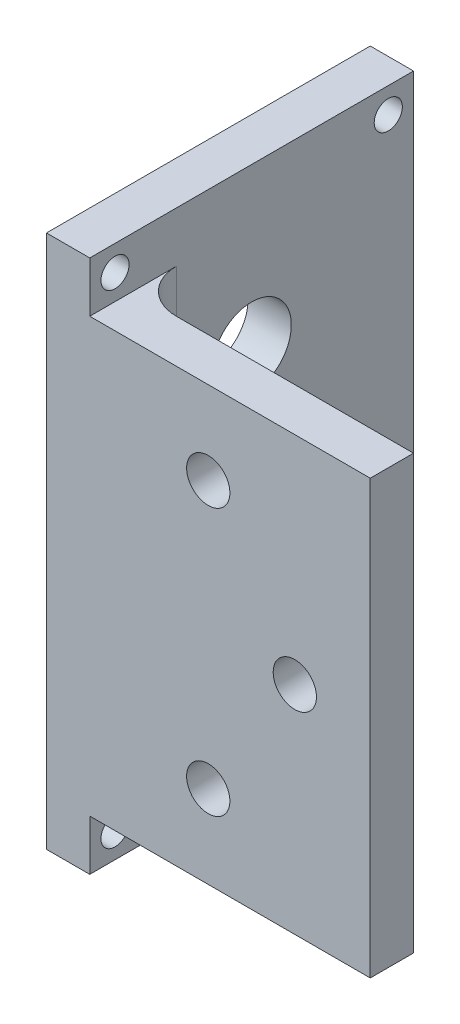
ISO-10303-21;
HEADER;
FILE_DESCRIPTION(('STEP AP214'),'2;1');
FILE_NAME('part.step','',(''),(''),'','','');
FILE_SCHEMA(('AUTOMOTIVE_DESIGN { 1 0 10303 214 1 1 1 1 }'));
ENDSEC;
DATA;
#1=APPLICATION_CONTEXT('core data for automotive mechanical design processes');
#2=APPLICATION_PROTOCOL_DEFINITION('international standard','automotive_design',2000,#1);
#3=PRODUCT_CONTEXT('',#1,'mechanical');
#4=PRODUCT('Part','Part','',(#3));
#5=PRODUCT_RELATED_PRODUCT_CATEGORY('part','',(#4));
#6=PRODUCT_DEFINITION_FORMATION('','',#4);
#7=PRODUCT_DEFINITION_CONTEXT('part definition',#1,'design');
#8=PRODUCT_DEFINITION('design','',#6,#7);
#9=PRODUCT_DEFINITION_SHAPE('','',#8);
#10=(LENGTH_UNIT() NAMED_UNIT(*) SI_UNIT(.MILLI.,.METRE.));
#11=(NAMED_UNIT(*) PLANE_ANGLE_UNIT() SI_UNIT($,.RADIAN.));
#12=(NAMED_UNIT(*) SI_UNIT($,.STERADIAN.) SOLID_ANGLE_UNIT());
#13=UNCERTAINTY_MEASURE_WITH_UNIT(LENGTH_MEASURE(1.E-05),#10,'distance_accuracy_value','');
#14=(GEOMETRIC_REPRESENTATION_CONTEXT(3) GLOBAL_UNCERTAINTY_ASSIGNED_CONTEXT((#13)) GLOBAL_UNIT_ASSIGNED_CONTEXT((#10,
#11,#12)) REPRESENTATION_CONTEXT('',''));
#15=CARTESIAN_POINT('',(0.,0.,0.));
#16=DIRECTION('',(0.,0.,1.));
#17=DIRECTION('',(1.,0.,0.));
#18=AXIS2_PLACEMENT_3D('',#15,#16,#17);
#19=CARTESIAN_POINT('',(22.44,37.,-3.));
#20=DIRECTION('',(0.,0.,1.));
#21=DIRECTION('',(1.,0.,0.));
#22=AXIS2_PLACEMENT_3D('',#19,#20,#21);
#23=PLANE('',#22);
#24=CARTESIAN_POINT('',(11.2127855634639,27.75,-3.));
#25=DIRECTION('',(0.,0.,1.));
#26=DIRECTION('',(1.,0.,0.));
#27=AXIS2_PLACEMENT_3D('',#24,#25,#26);
#28=CIRCLE('',#27,1.5);
#29=CARTESIAN_POINT('',(12.7127855634639,27.75,-3.));
#30=VERTEX_POINT('',#29);
#31=EDGE_CURVE('E188',#30,#30,#28,.T.);
#32=ORIENTED_EDGE('',*,*,#31,.T.);
#33=EDGE_LOOP('',(#32));
#34=FACE_BOUND('',#33,.T.);
#35=CARTESIAN_POINT('',(17.2127855634639,18.5,-3.));
#36=DIRECTION('',(0.,0.,1.));
#37=DIRECTION('',(1.,0.,0.));
#38=AXIS2_PLACEMENT_3D('',#35,#36,#37);
#39=CIRCLE('',#38,1.5);
#40=CARTESIAN_POINT('',(18.7127855634639,18.5,-3.));
#41=VERTEX_POINT('',#40);
#42=EDGE_CURVE('E184',#41,#41,#39,.T.);
#43=ORIENTED_EDGE('',*,*,#42,.T.);
#44=EDGE_LOOP('',(#43));
#45=FACE_BOUND('',#44,.T.);
#46=CARTESIAN_POINT('',(11.2127855634639,9.25,-3.));
#47=DIRECTION('',(0.,0.,1.));
#48=DIRECTION('',(1.,0.,0.));
#49=AXIS2_PLACEMENT_3D('',#46,#47,#48);
#50=CIRCLE('',#49,1.5);
#51=CARTESIAN_POINT('',(12.7127855634639,9.25,-3.));
#52=VERTEX_POINT('',#51);
#53=EDGE_CURVE('E180',#52,#52,#50,.T.);
#54=ORIENTED_EDGE('',*,*,#53,.T.);
#55=EDGE_LOOP('',(#54));
#56=FACE_BOUND('',#55,.T.);
#57=DIRECTION('',(0.,-1.,0.));
#58=VECTOR('',#57,1.);
#59=CARTESIAN_POINT('',(22.44,37.,-3.));
#60=LINE('',#59,#58);
#61=CARTESIAN_POINT('',(22.44,33.5,-3.));
#62=VERTEX_POINT('',#61);
#63=CARTESIAN_POINT('',(22.44,3.5,-3.));
#64=VERTEX_POINT('',#63);
#65=EDGE_CURVE('E206',#62,#64,#60,.T.);
#66=ORIENTED_EDGE('',*,*,#65,.T.);
#67=DIRECTION('',(-1.,0.,0.));
#68=VECTOR('',#67,1.);
#69=CARTESIAN_POINT('',(22.44,3.5,-3.));
#70=LINE('',#69,#68);
#71=CARTESIAN_POINT('',(6.,3.5,-3.));
#72=VERTEX_POINT('',#71);
#73=EDGE_CURVE('E176',#64,#72,#70,.T.);
#74=ORIENTED_EDGE('',*,*,#73,.T.);
#75=DIRECTION('',(0.,-1.,0.));
#76=VECTOR('',#75,1.);
#77=CARTESIAN_POINT('',(6.,37.,-3.));
#78=LINE('',#77,#76);
#79=CARTESIAN_POINT('',(6.,33.5,-3.));
#80=VERTEX_POINT('',#79);
#81=EDGE_CURVE('E235',#72,#80,#78,.F.);
#82=ORIENTED_EDGE('',*,*,#81,.T.);
#83=DIRECTION('',(1.,0.,0.));
#84=VECTOR('',#83,1.);
#85=CARTESIAN_POINT('',(22.44,33.5,-3.));
#86=LINE('',#85,#84);
#87=EDGE_CURVE('E68',#80,#62,#86,.T.);
#88=ORIENTED_EDGE('',*,*,#87,.T.);
#89=EDGE_LOOP('',(#66,#74,#82,#88));
#90=FACE_BOUND('',#89,.T.);
#91=ADVANCED_FACE('F45',(#34,#45,#56,#90),#23,.F.);
#92=CARTESIAN_POINT('',(3.,37.,-3.));
#93=DIRECTION('',(-1.,0.,0.));
#94=DIRECTION('',(0.,0.,1.));
#95=AXIS2_PLACEMENT_3D('',#92,#93,#94);
#96=PLANE('',#95);
#97=CARTESIAN_POINT('',(3.,26.,-11.22));
#98=DIRECTION('',(-1.,0.,0.));
#99=DIRECTION('',(0.,0.,1.));
#100=AXIS2_PLACEMENT_3D('',#97,#98,#99);
#101=CIRCLE('',#100,2.75);
#102=CARTESIAN_POINT('',(3.,26.,-8.47));
#103=VERTEX_POINT('',#102);
#104=EDGE_CURVE('E148',#103,#103,#101,.T.);
#105=ORIENTED_EDGE('',*,*,#104,.T.);
#106=EDGE_LOOP('',(#105));
#107=FACE_BOUND('',#106,.T.);
#108=CARTESIAN_POINT('',(3.,35.25,-20.69));
#109=DIRECTION('',(-1.,0.,0.));
#110=DIRECTION('',(0.,0.,1.));
#111=AXIS2_PLACEMENT_3D('',#108,#109,#110);
#112=CIRCLE('',#111,0.974999999999995);
#113=CARTESIAN_POINT('',(3.,35.25,-19.715));
#114=VERTEX_POINT('',#113);
#115=EDGE_CURVE('E422',#114,#114,#112,.T.);
#116=ORIENTED_EDGE('',*,*,#115,.T.);
#117=EDGE_LOOP('',(#116));
#118=FACE_BOUND('',#117,.T.);
#119=CARTESIAN_POINT('',(3.,1.75,-20.69));
#120=DIRECTION('',(-1.,0.,0.));
#121=DIRECTION('',(0.,0.,1.));
#122=AXIS2_PLACEMENT_3D('',#119,#120,#121);
#123=CIRCLE('',#122,0.974999999999999);
#124=CARTESIAN_POINT('',(3.,1.75,-19.715));
#125=VERTEX_POINT('',#124);
#126=EDGE_CURVE('E425',#125,#125,#123,.T.);
#127=ORIENTED_EDGE('',*,*,#126,.T.);
#128=EDGE_LOOP('',(#127));
#129=FACE_BOUND('',#128,.T.);
#130=CARTESIAN_POINT('',(3.,1.75,-1.75));
#131=DIRECTION('',(-1.,0.,0.));
#132=DIRECTION('',(0.,0.,1.));
#133=AXIS2_PLACEMENT_3D('',#130,#131,#132);
#134=CIRCLE('',#133,0.974999999999999);
#135=CARTESIAN_POINT('',(3.,1.75,-0.775000000000001));
#136=VERTEX_POINT('',#135);
#137=EDGE_CURVE('E430',#136,#136,#134,.T.);
#138=ORIENTED_EDGE('',*,*,#137,.T.);
#139=EDGE_LOOP('',(#138));
#140=FACE_BOUND('',#139,.T.);
#141=CARTESIAN_POINT('',(3.,35.25,-1.75));
#142=DIRECTION('',(-1.,0.,0.));
#143=DIRECTION('',(0.,0.,1.));
#144=AXIS2_PLACEMENT_3D('',#141,#142,#143);
#145=CIRCLE('',#144,0.97500000000001);
#146=CARTESIAN_POINT('',(3.,35.25,-0.77499999999999));
#147=VERTEX_POINT('',#146);
#148=EDGE_CURVE('E436',#147,#147,#145,.T.);
#149=ORIENTED_EDGE('',*,*,#148,.T.);
#150=EDGE_LOOP('',(#149));
#151=FACE_BOUND('',#150,.T.);
#152=DIRECTION('',(0.,-1.,0.));
#153=VECTOR('',#152,1.);
#154=CARTESIAN_POINT('',(3.,0.,-6.));
#155=LINE('',#154,#153);
#156=CARTESIAN_POINT('',(3.,33.5,-6.));
#157=VERTEX_POINT('',#156);
#158=CARTESIAN_POINT('',(3.,3.5,-6.));
#159=VERTEX_POINT('',#158);
#160=EDGE_CURVE('E123',#157,#159,#155,.T.);
#161=ORIENTED_EDGE('',*,*,#160,.T.);
#162=DIRECTION('',(0.,0.,-1.));
#163=VECTOR('',#162,1.);
#164=CARTESIAN_POINT('',(3.,3.5,0.));
#165=LINE('',#164,#163);
#166=CARTESIAN_POINT('',(3.,3.5,0.));
#167=VERTEX_POINT('',#166);
#168=EDGE_CURVE('E61',#167,#159,#165,.T.);
#169=ORIENTED_EDGE('',*,*,#168,.F.);
#170=DIRECTION('',(0.,1.,0.));
#171=VECTOR('',#170,1.);
#172=CARTESIAN_POINT('',(3.,0.,0.));
#173=LINE('',#172,#171);
#174=CARTESIAN_POINT('',(3.,0.,0.));
#175=VERTEX_POINT('',#174);
#176=EDGE_CURVE('E119',#175,#167,#173,.T.);
#177=ORIENTED_EDGE('',*,*,#176,.F.);
#178=DIRECTION('',(0.,0.,-1.));
#179=VECTOR('',#178,1.);
#180=CARTESIAN_POINT('',(3.,0.,-3.));
#181=LINE('',#180,#179);
#182=CARTESIAN_POINT('',(3.,0.,-22.44));
#183=VERTEX_POINT('',#182);
#184=EDGE_CURVE('E192',#175,#183,#181,.T.);
#185=ORIENTED_EDGE('',*,*,#184,.T.);
#186=DIRECTION('',(0.,-1.,0.));
#187=VECTOR('',#186,1.);
#188=CARTESIAN_POINT('',(3.,37.,-22.44));
#189=LINE('',#188,#187);
#190=CARTESIAN_POINT('',(3.,37.,-22.44));
#191=VERTEX_POINT('',#190);
#192=EDGE_CURVE('E230',#191,#183,#189,.T.);
#193=ORIENTED_EDGE('',*,*,#192,.F.);
#194=DIRECTION('',(0.,0.,-1.));
#195=VECTOR('',#194,1.);
#196=CARTESIAN_POINT('',(3.,37.,-3.));
#197=LINE('',#196,#195);
#198=CARTESIAN_POINT('',(3.,37.,0.));
#199=VERTEX_POINT('',#198);
#200=EDGE_CURVE('E193',#199,#191,#197,.T.);
#201=ORIENTED_EDGE('',*,*,#200,.F.);
#202=DIRECTION('',(0.,1.,0.));
#203=VECTOR('',#202,1.);
#204=CARTESIAN_POINT('',(3.,37.,0.));
#205=LINE('',#204,#203);
#206=CARTESIAN_POINT('',(3.,33.5,0.));
#207=VERTEX_POINT('',#206);
#208=EDGE_CURVE('E141',#207,#199,#205,.T.);
#209=ORIENTED_EDGE('',*,*,#208,.F.);
#210=DIRECTION('',(0.,0.,-1.));
#211=VECTOR('',#210,1.);
#212=CARTESIAN_POINT('',(3.,33.5,0.));
#213=LINE('',#212,#211);
#214=EDGE_CURVE('E156',#207,#157,#213,.T.);
#215=ORIENTED_EDGE('',*,*,#214,.T.);
#216=EDGE_LOOP('',(#161,#169,#177,#185,#193,#201,#209,#215));
#217=FACE_BOUND('',#216,.T.);
#218=ADVANCED_FACE('F116',(#107,#118,#129,#140,#151,#217),#96,.F.);
#219=CARTESIAN_POINT('',(3.,37.,-22.44));
#220=DIRECTION('',(0.,0.,1.));
#221=DIRECTION('',(1.,0.,0.));
#222=AXIS2_PLACEMENT_3D('',#219,#220,#221);
#223=PLANE('',#222);
#224=DIRECTION('',(-1.,0.,0.));
#225=VECTOR('',#224,1.);
#226=CARTESIAN_POINT('',(3.,0.,-22.44));
#227=LINE('',#226,#225);
#228=CARTESIAN_POINT('',(0.,0.,-22.44));
#229=VERTEX_POINT('',#228);
#230=EDGE_CURVE('E209',#183,#229,#227,.T.);
#231=ORIENTED_EDGE('',*,*,#230,.T.);
#232=DIRECTION('',(0.,-1.,0.));
#233=VECTOR('',#232,1.);
#234=CARTESIAN_POINT('',(0.,37.,-22.44));
#235=LINE('',#234,#233);
#236=CARTESIAN_POINT('',(0.,37.,-22.44));
#237=VERTEX_POINT('',#236);
#238=EDGE_CURVE('E226',#237,#229,#235,.T.);
#239=ORIENTED_EDGE('',*,*,#238,.F.);
#240=DIRECTION('',(-1.,0.,0.));
#241=VECTOR('',#240,1.);
#242=CARTESIAN_POINT('',(3.,37.,-22.44));
#243=LINE('',#242,#241);
#244=EDGE_CURVE('E196',#191,#237,#243,.T.);
#245=ORIENTED_EDGE('',*,*,#244,.F.);
#246=ORIENTED_EDGE('',*,*,#192,.T.);
#247=EDGE_LOOP('',(#231,#239,#245,#246));
#248=FACE_BOUND('',#247,.T.);
#249=ADVANCED_FACE('F262',(#248),#223,.F.);
#250=CARTESIAN_POINT('',(0.,37.,-22.44));
#251=DIRECTION('',(1.,0.,0.));
#252=DIRECTION('',(0.,0.,-1.));
#253=AXIS2_PLACEMENT_3D('',#250,#251,#252);
#254=PLANE('',#253);
#255=CARTESIAN_POINT('',(0.,26.,-11.22));
#256=DIRECTION('',(-1.,0.,0.));
#257=DIRECTION('',(0.,0.,1.));
#258=AXIS2_PLACEMENT_3D('',#255,#256,#257);
#259=CIRCLE('',#258,2.75);
#260=CARTESIAN_POINT('',(0.,26.,-8.47));
#261=VERTEX_POINT('',#260);
#262=EDGE_CURVE('E418',#261,#261,#259,.T.);
#263=ORIENTED_EDGE('',*,*,#262,.F.);
#264=EDGE_LOOP('',(#263));
#265=FACE_BOUND('',#264,.T.);
#266=CARTESIAN_POINT('',(0.,35.25,-20.69));
#267=DIRECTION('',(-1.,0.,0.));
#268=DIRECTION('',(0.,0.,1.));
#269=AXIS2_PLACEMENT_3D('',#266,#267,#268);
#270=CIRCLE('',#269,0.974999999999995);
#271=CARTESIAN_POINT('',(0.,35.25,-19.715));
#272=VERTEX_POINT('',#271);
#273=EDGE_CURVE('E447',#272,#272,#270,.T.);
#274=ORIENTED_EDGE('',*,*,#273,.F.);
#275=EDGE_LOOP('',(#274));
#276=FACE_BOUND('',#275,.T.);
#277=CARTESIAN_POINT('',(0.,1.75,-20.69));
#278=DIRECTION('',(-1.,0.,0.));
#279=DIRECTION('',(0.,0.,1.));
#280=AXIS2_PLACEMENT_3D('',#277,#278,#279);
#281=CIRCLE('',#280,0.974999999999999);
#282=CARTESIAN_POINT('',(0.,1.75,-19.715));
#283=VERTEX_POINT('',#282);
#284=EDGE_CURVE('E451',#283,#283,#281,.T.);
#285=ORIENTED_EDGE('',*,*,#284,.F.);
#286=EDGE_LOOP('',(#285));
#287=FACE_BOUND('',#286,.T.);
#288=CARTESIAN_POINT('',(0.,1.75,-1.75));
#289=DIRECTION('',(-1.,0.,0.));
#290=DIRECTION('',(0.,0.,1.));
#291=AXIS2_PLACEMENT_3D('',#288,#289,#290);
#292=CIRCLE('',#291,0.974999999999999);
#293=CARTESIAN_POINT('',(0.,1.75,-0.775000000000002));
#294=VERTEX_POINT('',#293);
#295=EDGE_CURVE('E444',#294,#294,#292,.T.);
#296=ORIENTED_EDGE('',*,*,#295,.F.);
#297=EDGE_LOOP('',(#296));
#298=FACE_BOUND('',#297,.T.);
#299=CARTESIAN_POINT('',(0.,35.25,-1.75));
#300=DIRECTION('',(-1.,0.,0.));
#301=DIRECTION('',(0.,0.,1.));
#302=AXIS2_PLACEMENT_3D('',#299,#300,#301);
#303=CIRCLE('',#302,0.97500000000001);
#304=CARTESIAN_POINT('',(0.,35.25,-0.77499999999999));
#305=VERTEX_POINT('',#304);
#306=EDGE_CURVE('E440',#305,#305,#303,.T.);
#307=ORIENTED_EDGE('',*,*,#306,.F.);
#308=EDGE_LOOP('',(#307));
#309=FACE_BOUND('',#308,.T.);
#310=DIRECTION('',(0.,0.,1.));
#311=VECTOR('',#310,1.);
#312=CARTESIAN_POINT('',(0.,0.,-22.44));
#313=LINE('',#312,#311);
#314=CARTESIAN_POINT('',(0.,0.,0.));
#315=VERTEX_POINT('',#314);
#316=EDGE_CURVE('E212',#229,#315,#313,.T.);
#317=ORIENTED_EDGE('',*,*,#316,.T.);
#318=DIRECTION('',(0.,-1.,0.));
#319=VECTOR('',#318,1.);
#320=CARTESIAN_POINT('',(0.,37.,0.));
#321=LINE('',#320,#319);
#322=CARTESIAN_POINT('',(0.,37.,0.));
#323=VERTEX_POINT('',#322);
#324=EDGE_CURVE('E223',#323,#315,#321,.T.);
#325=ORIENTED_EDGE('',*,*,#324,.F.);
#326=DIRECTION('',(0.,0.,1.));
#327=VECTOR('',#326,1.);
#328=CARTESIAN_POINT('',(0.,37.,-22.44));
#329=LINE('',#328,#327);
#330=EDGE_CURVE('E199',#237,#323,#329,.T.);
#331=ORIENTED_EDGE('',*,*,#330,.F.);
#332=ORIENTED_EDGE('',*,*,#238,.T.);
#333=EDGE_LOOP('',(#317,#325,#331,#332));
#334=FACE_BOUND('',#333,.T.);
#335=ADVANCED_FACE('F263',(#265,#276,#287,#298,#309,#334),#254,.F.);
#336=CARTESIAN_POINT('',(0.,37.,0.));
#337=DIRECTION('',(0.,0.,-1.));
#338=DIRECTION('',(-1.,0.,0.));
#339=AXIS2_PLACEMENT_3D('',#336,#337,#338);
#340=PLANE('',#339);
#341=CARTESIAN_POINT('',(11.2127855634639,27.75,0.));
#342=DIRECTION('',(0.,0.,-1.));
#343=DIRECTION('',(-1.,0.,0.));
#344=AXIS2_PLACEMENT_3D('',#341,#342,#343);
#345=CIRCLE('',#344,1.5);
#346=CARTESIAN_POINT('',(9.71278556346392,27.75,0.));
#347=VERTEX_POINT('',#346);
#348=EDGE_CURVE('E159',#347,#347,#345,.T.);
#349=ORIENTED_EDGE('',*,*,#348,.T.);
#350=EDGE_LOOP('',(#349));
#351=FACE_BOUND('',#350,.T.);
#352=CARTESIAN_POINT('',(17.2127855634639,18.5,0.));
#353=DIRECTION('',(0.,0.,-1.));
#354=DIRECTION('',(-1.,0.,0.));
#355=AXIS2_PLACEMENT_3D('',#352,#353,#354);
#356=CIRCLE('',#355,1.5);
#357=CARTESIAN_POINT('',(15.7127855634639,18.5,0.));
#358=VERTEX_POINT('',#357);
#359=EDGE_CURVE('E166',#358,#358,#356,.T.);
#360=ORIENTED_EDGE('',*,*,#359,.T.);
#361=EDGE_LOOP('',(#360));
#362=FACE_BOUND('',#361,.T.);
#363=CARTESIAN_POINT('',(11.2127855634639,9.25,0.));
#364=DIRECTION('',(0.,0.,-1.));
#365=DIRECTION('',(-1.,0.,0.));
#366=AXIS2_PLACEMENT_3D('',#363,#364,#365);
#367=CIRCLE('',#366,1.5);
#368=CARTESIAN_POINT('',(9.71278556346392,9.25,0.));
#369=VERTEX_POINT('',#368);
#370=EDGE_CURVE('E170',#369,#369,#367,.T.);
#371=ORIENTED_EDGE('',*,*,#370,.T.);
#372=EDGE_LOOP('',(#371));
#373=FACE_BOUND('',#372,.T.);
#374=DIRECTION('',(1.,0.,0.));
#375=VECTOR('',#374,1.);
#376=CARTESIAN_POINT('',(0.,0.,0.));
#377=LINE('',#376,#375);
#378=EDGE_CURVE('E139',#315,#175,#377,.T.);
#379=ORIENTED_EDGE('',*,*,#378,.T.);
#380=ORIENTED_EDGE('',*,*,#176,.T.);
#381=DIRECTION('',(1.,0.,0.));
#382=VECTOR('',#381,1.);
#383=CARTESIAN_POINT('',(3.,3.5,0.));
#384=LINE('',#383,#382);
#385=CARTESIAN_POINT('',(22.44,3.5,0.));
#386=VERTEX_POINT('',#385);
#387=EDGE_CURVE('E126',#167,#386,#384,.T.);
#388=ORIENTED_EDGE('',*,*,#387,.T.);
#389=DIRECTION('',(0.,-1.,0.));
#390=VECTOR('',#389,1.);
#391=CARTESIAN_POINT('',(22.44,37.,0.));
#392=LINE('',#391,#390);
#393=CARTESIAN_POINT('',(22.44,33.5,0.));
#394=VERTEX_POINT('',#393);
#395=EDGE_CURVE('E220',#394,#386,#392,.T.);
#396=ORIENTED_EDGE('',*,*,#395,.F.);
#397=DIRECTION('',(-1.,0.,0.));
#398=VECTOR('',#397,1.);
#399=CARTESIAN_POINT('',(3.,33.5,0.));
#400=LINE('',#399,#398);
#401=EDGE_CURVE('E145',#394,#207,#400,.T.);
#402=ORIENTED_EDGE('',*,*,#401,.T.);
#403=ORIENTED_EDGE('',*,*,#208,.T.);
#404=DIRECTION('',(1.,0.,0.));
#405=VECTOR('',#404,1.);
#406=CARTESIAN_POINT('',(0.,37.,0.));
#407=LINE('',#406,#405);
#408=EDGE_CURVE('E202',#323,#199,#407,.T.);
#409=ORIENTED_EDGE('',*,*,#408,.F.);
#410=ORIENTED_EDGE('',*,*,#324,.T.);
#411=EDGE_LOOP('',(#379,#380,#388,#396,#402,#403,#409,#410));
#412=FACE_BOUND('',#411,.T.);
#413=ADVANCED_FACE('F136',(#351,#362,#373,#412),#340,.F.);
#414=CARTESIAN_POINT('',(22.44,37.,0.));
#415=DIRECTION('',(-1.,0.,0.));
#416=DIRECTION('',(0.,0.,1.));
#417=AXIS2_PLACEMENT_3D('',#414,#415,#416);
#418=PLANE('',#417);
#419=ORIENTED_EDGE('',*,*,#395,.T.);
#420=DIRECTION('',(0.,0.,-1.));
#421=VECTOR('',#420,1.);
#422=CARTESIAN_POINT('',(22.44,3.5,0.));
#423=LINE('',#422,#421);
#424=EDGE_CURVE('E125',#386,#64,#423,.T.);
#425=ORIENTED_EDGE('',*,*,#424,.T.);
#426=ORIENTED_EDGE('',*,*,#65,.F.);
#427=DIRECTION('',(0.,0.,-1.));
#428=VECTOR('',#427,1.);
#429=CARTESIAN_POINT('',(22.44,33.5,0.));
#430=LINE('',#429,#428);
#431=EDGE_CURVE('E153',#394,#62,#430,.T.);
#432=ORIENTED_EDGE('',*,*,#431,.F.);
#433=EDGE_LOOP('',(#419,#425,#426,#432));
#434=FACE_BOUND('',#433,.T.);
#435=ADVANCED_FACE('F244',(#434),#418,.F.);
#436=CARTESIAN_POINT('',(0.,37.,0.));
#437=DIRECTION('',(0.,-1.,0.));
#438=DIRECTION('',(0.,0.,-1.));
#439=AXIS2_PLACEMENT_3D('',#436,#437,#438);
#440=PLANE('',#439);
#441=ORIENTED_EDGE('',*,*,#408,.T.);
#442=ORIENTED_EDGE('',*,*,#200,.T.);
#443=ORIENTED_EDGE('',*,*,#244,.T.);
#444=ORIENTED_EDGE('',*,*,#330,.T.);
#445=EDGE_LOOP('',(#441,#442,#443,#444));
#446=FACE_BOUND('',#445,.T.);
#447=ADVANCED_FACE('F252',(#446),#440,.F.);
#448=CARTESIAN_POINT('',(0.,0.,0.));
#449=DIRECTION('',(0.,-1.,0.));
#450=DIRECTION('',(0.,0.,-1.));
#451=AXIS2_PLACEMENT_3D('',#448,#449,#450);
#452=PLANE('',#451);
#453=ORIENTED_EDGE('',*,*,#184,.F.);
#454=ORIENTED_EDGE('',*,*,#378,.F.);
#455=ORIENTED_EDGE('',*,*,#316,.F.);
#456=ORIENTED_EDGE('',*,*,#230,.F.);
#457=EDGE_LOOP('',(#453,#454,#455,#456));
#458=FACE_BOUND('',#457,.T.);
#459=ADVANCED_FACE('F259',(#458),#452,.T.);
#460=CARTESIAN_POINT('',(6.,37.,-6.));
#461=DIRECTION('',(0.,1.,0.));
#462=DIRECTION('',(0.,0.,1.));
#463=AXIS2_PLACEMENT_3D('',#460,#461,#462);
#464=CYLINDRICAL_SURFACE('',#463,3.);
#465=ORIENTED_EDGE('',*,*,#81,.F.);
#466=CARTESIAN_POINT('',(6.,3.5,-6.));
#467=DIRECTION('',(0.,1.,0.));
#468=DIRECTION('',(-1.,0.,0.));
#469=AXIS2_PLACEMENT_3D('',#466,#467,#468);
#470=CIRCLE('',#469,3.);
#471=EDGE_CURVE('E11',#72,#159,#470,.F.);
#472=ORIENTED_EDGE('',*,*,#471,.T.);
#473=ORIENTED_EDGE('',*,*,#160,.F.);
#474=CARTESIAN_POINT('',(6.,33.5,-6.));
#475=DIRECTION('',(0.,-1.,0.));
#476=DIRECTION('',(0.,0.,-1.));
#477=AXIS2_PLACEMENT_3D('',#474,#475,#476);
#478=CIRCLE('',#477,3.);
#479=EDGE_CURVE('E54',#157,#80,#478,.F.);
#480=ORIENTED_EDGE('',*,*,#479,.T.);
#481=EDGE_LOOP('',(#465,#472,#473,#480));
#482=FACE_BOUND('',#481,.T.);
#483=ADVANCED_FACE('F47',(#482),#464,.F.);
#484=CARTESIAN_POINT('',(3.,33.5,0.));
#485=DIRECTION('',(0.,-1.,0.));
#486=DIRECTION('',(0.,0.,-1.));
#487=AXIS2_PLACEMENT_3D('',#484,#485,#486);
#488=PLANE('',#487);
#489=ORIENTED_EDGE('',*,*,#479,.F.);
#490=ORIENTED_EDGE('',*,*,#214,.F.);
#491=ORIENTED_EDGE('',*,*,#401,.F.);
#492=ORIENTED_EDGE('',*,*,#431,.T.);
#493=ORIENTED_EDGE('',*,*,#87,.F.);
#494=EDGE_LOOP('',(#489,#490,#491,#492,#493));
#495=FACE_BOUND('',#494,.T.);
#496=ADVANCED_FACE('F248',(#495),#488,.F.);
#497=CARTESIAN_POINT('',(3.,3.5,0.));
#498=DIRECTION('',(0.,1.,0.));
#499=DIRECTION('',(-1.,0.,0.));
#500=AXIS2_PLACEMENT_3D('',#497,#498,#499);
#501=PLANE('',#500);
#502=ORIENTED_EDGE('',*,*,#424,.F.);
#503=ORIENTED_EDGE('',*,*,#387,.F.);
#504=ORIENTED_EDGE('',*,*,#168,.T.);
#505=ORIENTED_EDGE('',*,*,#471,.F.);
#506=ORIENTED_EDGE('',*,*,#73,.F.);
#507=EDGE_LOOP('',(#502,#503,#504,#505,#506));
#508=FACE_BOUND('',#507,.T.);
#509=ADVANCED_FACE('F129',(#508),#501,.F.);
#510=CARTESIAN_POINT('',(11.2127855634639,9.25,0.));
#511=DIRECTION('',(0.,0.,-1.));
#512=DIRECTION('',(-1.,0.,0.));
#513=AXIS2_PLACEMENT_3D('',#510,#511,#512);
#514=CYLINDRICAL_SURFACE('',#513,1.5);
#515=ORIENTED_EDGE('',*,*,#370,.F.);
#516=EDGE_LOOP('',(#515));
#517=FACE_BOUND('',#516,.T.);
#518=ORIENTED_EDGE('',*,*,#53,.F.);
#519=EDGE_LOOP('',(#518));
#520=FACE_BOUND('',#519,.T.);
#521=ADVANCED_FACE('F290',(#517,#520),#514,.F.);
#522=CARTESIAN_POINT('',(17.2127855634639,18.5,0.));
#523=DIRECTION('',(0.,0.,-1.));
#524=DIRECTION('',(-1.,0.,0.));
#525=AXIS2_PLACEMENT_3D('',#522,#523,#524);
#526=CYLINDRICAL_SURFACE('',#525,1.5);
#527=ORIENTED_EDGE('',*,*,#359,.F.);
#528=EDGE_LOOP('',(#527));
#529=FACE_BOUND('',#528,.T.);
#530=ORIENTED_EDGE('',*,*,#42,.F.);
#531=EDGE_LOOP('',(#530));
#532=FACE_BOUND('',#531,.T.);
#533=ADVANCED_FACE('F292',(#529,#532),#526,.F.);
#534=CARTESIAN_POINT('',(11.2127855634639,27.75,0.));
#535=DIRECTION('',(0.,0.,-1.));
#536=DIRECTION('',(-1.,0.,0.));
#537=AXIS2_PLACEMENT_3D('',#534,#535,#536);
#538=CYLINDRICAL_SURFACE('',#537,1.5);
#539=ORIENTED_EDGE('',*,*,#348,.F.);
#540=EDGE_LOOP('',(#539));
#541=FACE_BOUND('',#540,.T.);
#542=ORIENTED_EDGE('',*,*,#31,.F.);
#543=EDGE_LOOP('',(#542));
#544=FACE_BOUND('',#543,.T.);
#545=ADVANCED_FACE('F299',(#541,#544),#538,.F.);
#546=CARTESIAN_POINT('',(22.44,35.25,-1.74999999999999));
#547=DIRECTION('',(-1.,0.,0.));
#548=DIRECTION('',(0.,0.,1.));
#549=AXIS2_PLACEMENT_3D('',#546,#547,#548);
#550=CYLINDRICAL_SURFACE('',#549,0.97500000000001);
#551=ORIENTED_EDGE('',*,*,#306,.T.);
#552=EDGE_LOOP('',(#551));
#553=FACE_BOUND('',#552,.T.);
#554=ORIENTED_EDGE('',*,*,#148,.F.);
#555=EDGE_LOOP('',(#554));
#556=FACE_BOUND('',#555,.T.);
#557=ADVANCED_FACE('F365',(#553,#556),#550,.F.);
#558=CARTESIAN_POINT('',(22.44,1.75,-1.75));
#559=DIRECTION('',(-1.,0.,0.));
#560=DIRECTION('',(0.,0.,1.));
#561=AXIS2_PLACEMENT_3D('',#558,#559,#560);
#562=CYLINDRICAL_SURFACE('',#561,0.974999999999999);
#563=ORIENTED_EDGE('',*,*,#295,.T.);
#564=EDGE_LOOP('',(#563));
#565=FACE_BOUND('',#564,.T.);
#566=ORIENTED_EDGE('',*,*,#137,.F.);
#567=EDGE_LOOP('',(#566));
#568=FACE_BOUND('',#567,.T.);
#569=ADVANCED_FACE('F373',(#565,#568),#562,.F.);
#570=CARTESIAN_POINT('',(22.44,1.75,-20.69));
#571=DIRECTION('',(-1.,0.,0.));
#572=DIRECTION('',(0.,0.,1.));
#573=AXIS2_PLACEMENT_3D('',#570,#571,#572);
#574=CYLINDRICAL_SURFACE('',#573,0.974999999999999);
#575=ORIENTED_EDGE('',*,*,#284,.T.);
#576=EDGE_LOOP('',(#575));
#577=FACE_BOUND('',#576,.T.);
#578=ORIENTED_EDGE('',*,*,#126,.F.);
#579=EDGE_LOOP('',(#578));
#580=FACE_BOUND('',#579,.T.);
#581=ADVANCED_FACE('F383',(#577,#580),#574,.F.);
#582=CARTESIAN_POINT('',(22.44,35.25,-20.69));
#583=DIRECTION('',(-1.,0.,0.));
#584=DIRECTION('',(0.,0.,1.));
#585=AXIS2_PLACEMENT_3D('',#582,#583,#584);
#586=CYLINDRICAL_SURFACE('',#585,0.974999999999995);
#587=ORIENTED_EDGE('',*,*,#273,.T.);
#588=EDGE_LOOP('',(#587));
#589=FACE_BOUND('',#588,.T.);
#590=ORIENTED_EDGE('',*,*,#115,.F.);
#591=EDGE_LOOP('',(#590));
#592=FACE_BOUND('',#591,.T.);
#593=ADVANCED_FACE('F393',(#589,#592),#586,.F.);
#594=CARTESIAN_POINT('',(22.44,26.,-11.22));
#595=DIRECTION('',(-1.,0.,0.));
#596=DIRECTION('',(0.,0.,1.));
#597=AXIS2_PLACEMENT_3D('',#594,#595,#596);
#598=CYLINDRICAL_SURFACE('',#597,2.75);
#599=ORIENTED_EDGE('',*,*,#262,.T.);
#600=EDGE_LOOP('',(#599));
#601=FACE_BOUND('',#600,.T.);
#602=ORIENTED_EDGE('',*,*,#104,.F.);
#603=EDGE_LOOP('',(#602));
#604=FACE_BOUND('',#603,.T.);
#605=ADVANCED_FACE('F403',(#601,#604),#598,.F.);
#606=CLOSED_SHELL('',(#91,#218,#249,#335,#413,#435,#447,#459,#483,#496,#509,#521,#533,#545,#557,
#569,#581,#593,#605));
#607=MANIFOLD_SOLID_BREP('B2',#606);
#608=ADVANCED_BREP_SHAPE_REPRESENTATION('',(#18,#607),#14);
#609=SHAPE_DEFINITION_REPRESENTATION(#9,#608);
ENDSEC;
END-ISO-10303-21;
